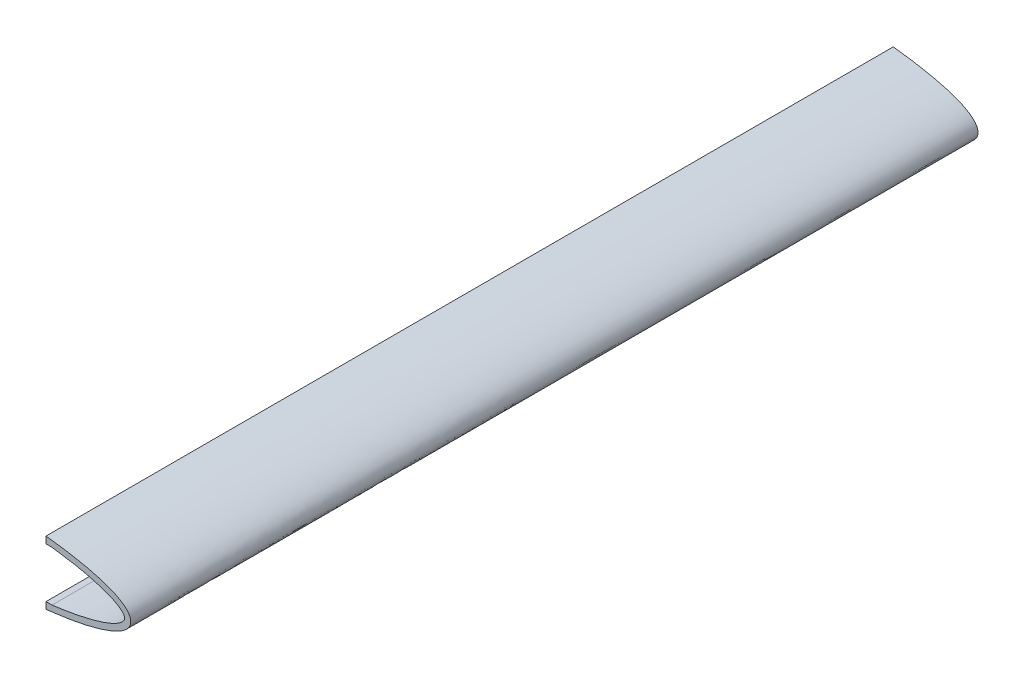
ISO-10303-21;
HEADER;
FILE_DESCRIPTION(('STEP AP214'),'2;1');
FILE_NAME('part.step','',(''),(''),'','','');
FILE_SCHEMA(('AUTOMOTIVE_DESIGN { 1 0 10303 214 1 1 1 1 }'));
ENDSEC;
DATA;
#1=APPLICATION_CONTEXT('core data for automotive mechanical design processes');
#2=APPLICATION_PROTOCOL_DEFINITION('international standard','automotive_design',2000,#1);
#3=PRODUCT_CONTEXT('',#1,'mechanical');
#4=PRODUCT('Part','Part','',(#3));
#5=PRODUCT_RELATED_PRODUCT_CATEGORY('part','',(#4));
#6=PRODUCT_DEFINITION_FORMATION('','',#4);
#7=PRODUCT_DEFINITION_CONTEXT('part definition',#1,'design');
#8=PRODUCT_DEFINITION('design','',#6,#7);
#9=PRODUCT_DEFINITION_SHAPE('','',#8);
#10=(LENGTH_UNIT() NAMED_UNIT(*) SI_UNIT(.MILLI.,.METRE.));
#11=(NAMED_UNIT(*) PLANE_ANGLE_UNIT() SI_UNIT($,.RADIAN.));
#12=(NAMED_UNIT(*) SI_UNIT($,.STERADIAN.) SOLID_ANGLE_UNIT());
#13=UNCERTAINTY_MEASURE_WITH_UNIT(LENGTH_MEASURE(1.E-05),#10,'distance_accuracy_value','');
#14=(GEOMETRIC_REPRESENTATION_CONTEXT(3) GLOBAL_UNCERTAINTY_ASSIGNED_CONTEXT((#13)) GLOBAL_UNIT_ASSIGNED_CONTEXT((#10,
#11,#12)) REPRESENTATION_CONTEXT('',''));
#15=CARTESIAN_POINT('',(0.,0.,0.));
#16=DIRECTION('',(0.,0.,1.));
#17=DIRECTION('',(1.,0.,0.));
#18=AXIS2_PLACEMENT_3D('',#15,#16,#17);
#19=CARTESIAN_POINT('',(0.,0.,444.5));
#20=CARTESIAN_POINT('',(2.09044576626194,0.236931140358332,444.5));
#21=CARTESIAN_POINT('',(6.7724621884355,0.820622556426648,444.5));
#22=CARTESIAN_POINT('',(13.771607217299,1.90452033628238,444.5));
#23=CARTESIAN_POINT('',(20.7200301298718,3.27191578656055,444.5));
#24=CARTESIAN_POINT('',(26.8369405741616,4.7927399076136,444.5));
#25=CARTESIAN_POINT('',(32.0875796112864,6.45216276775387,444.5));
#26=CARTESIAN_POINT('',(36.4452705499922,8.23472914772265,444.5));
#27=CARTESIAN_POINT('',(39.8961165926382,10.1283791479551,444.5));
#28=CARTESIAN_POINT('',(42.4348077096758,12.1368502495062,444.5));
#29=CARTESIAN_POINT('',(44.0608187154585,14.3087319322237,444.5));
#30=CARTESIAN_POINT('',(44.631372315666,16.6769815294237,444.5));
#31=CARTESIAN_POINT('',(44.0608187154579,19.0452311266237,444.5));
#32=CARTESIAN_POINT('',(42.4348077096748,21.2171128093407,444.5));
#33=CARTESIAN_POINT('',(39.8961165926364,23.2255839108912,444.5));
#34=CARTESIAN_POINT('',(36.44527054999,25.1192339111227,444.5));
#35=CARTESIAN_POINT('',(32.0875796112838,26.9018002910903,444.5));
#36=CARTESIAN_POINT('',(26.8369405741584,28.5612231512293,444.5));
#37=CARTESIAN_POINT('',(20.7200301298683,30.0820472722807,444.5));
#38=CARTESIAN_POINT('',(13.7716072172952,31.4494427225571,444.5));
#39=CARTESIAN_POINT('',(6.7724621884328,32.5333405024108,444.5));
#40=CARTESIAN_POINT('',(2.09044576626058,33.1170319184778,444.5));
#41=CARTESIAN_POINT('',(0.,33.3539630588361,444.5));
#42=B_SPLINE_CURVE_WITH_KNOTS('',3,(#19,#20,#21,#22,#23,#24,#25,#26,#27,#28,#29,#30,#31,#32,#33,
#34,#35,#36,#37,#38,#39,#40,#41),.UNSPECIFIED.,.F.,.F.,(4,1,1,1,1,1,1,1,1,1,1,1,1,1,1,1,1,1,1,1,
4),(0.424329698272851,0.434027755192763,0.446078200544609,0.456972304506157,0.466663037034508,
0.475120703886839,0.482336017878992,0.488336068220101,0.493209752146516,0.497165061608802,
0.500617191900712,0.504069322192621,0.508024631654907,0.512898315581322,0.518898365922431,
0.526113679914584,0.534571346766916,0.544262079295266,0.555156183256814,0.56720662860866,
0.576904685528565),.UNSPECIFIED.);
#43=DIRECTION('',(0.,0.,-1.));
#44=VECTOR('',#43,1.);
#45=SURFACE_OF_LINEAR_EXTRUSION('',#42,#44);
#46=CARTESIAN_POINT('',(0.,0.,0.));
#47=CARTESIAN_POINT('',(2.09044576626194,0.236931140358332,0.));
#48=CARTESIAN_POINT('',(6.7724621884355,0.820622556426648,0.));
#49=CARTESIAN_POINT('',(13.771607217299,1.90452033628238,0.));
#50=CARTESIAN_POINT('',(20.7200301298718,3.27191578656055,0.));
#51=CARTESIAN_POINT('',(26.8369405741616,4.7927399076136,0.));
#52=CARTESIAN_POINT('',(32.0875796112864,6.45216276775387,0.));
#53=CARTESIAN_POINT('',(36.4452705499922,8.23472914772265,0.));
#54=CARTESIAN_POINT('',(39.8961165926382,10.1283791479551,0.));
#55=CARTESIAN_POINT('',(42.4348077096758,12.1368502495062,0.));
#56=CARTESIAN_POINT('',(44.0608187154585,14.3087319322237,0.));
#57=CARTESIAN_POINT('',(44.631372315666,16.6769815294237,0.));
#58=CARTESIAN_POINT('',(44.0608187154579,19.0452311266237,0.));
#59=CARTESIAN_POINT('',(42.4348077096748,21.2171128093407,0.));
#60=CARTESIAN_POINT('',(39.8961165926364,23.2255839108912,0.));
#61=CARTESIAN_POINT('',(36.44527054999,25.1192339111227,0.));
#62=CARTESIAN_POINT('',(32.0875796112838,26.9018002910903,0.));
#63=CARTESIAN_POINT('',(26.8369405741584,28.5612231512293,0.));
#64=CARTESIAN_POINT('',(20.7200301298683,30.0820472722807,0.));
#65=CARTESIAN_POINT('',(13.7716072172952,31.4494427225571,0.));
#66=CARTESIAN_POINT('',(6.7724621884328,32.5333405024108,0.));
#67=CARTESIAN_POINT('',(2.09044576626058,33.1170319184778,0.));
#68=CARTESIAN_POINT('',(0.,33.3539630588361,0.));
#69=B_SPLINE_CURVE_WITH_KNOTS('',3,(#46,#47,#48,#49,#50,#51,#52,#53,#54,#55,#56,#57,#58,#59,#60,
#61,#62,#63,#64,#65,#66,#67,#68),.UNSPECIFIED.,.F.,.F.,(4,1,1,1,1,1,1,1,1,1,1,1,1,1,1,1,1,1,1,1,
4),(0.424329698272851,0.434027755192763,0.446078200544609,0.456972304506157,0.466663037034508,
0.475120703886839,0.482336017878992,0.488336068220101,0.493209752146516,0.497165061608802,
0.500617191900712,0.504069322192621,0.508024631654907,0.512898315581322,0.518898365922431,
0.526113679914584,0.534571346766916,0.544262079295266,0.555156183256814,0.56720662860866,
0.576904685528565),.UNSPECIFIED.);
#70=CARTESIAN_POINT('',(0.,0.,0.));
#71=VERTEX_POINT('',#70);
#72=CARTESIAN_POINT('',(0.,33.3539630588361,0.));
#73=VERTEX_POINT('',#72);
#74=EDGE_CURVE('E124',#71,#73,#69,.T.);
#75=ORIENTED_EDGE('',*,*,#74,.T.);
#76=DIRECTION('',(0.,0.,-1.));
#77=VECTOR('',#76,1.);
#78=CARTESIAN_POINT('',(0.,33.3539630588361,444.5));
#79=LINE('',#78,#77);
#80=CARTESIAN_POINT('',(0.,33.3539630588361,444.5));
#81=VERTEX_POINT('',#80);
#82=EDGE_CURVE('E11',#81,#73,#79,.T.);
#83=ORIENTED_EDGE('',*,*,#82,.F.);
#84=CARTESIAN_POINT('',(0.,0.,444.5));
#85=VERTEX_POINT('',#84);
#86=EDGE_CURVE('E144',#85,#81,#42,.T.);
#87=ORIENTED_EDGE('',*,*,#86,.F.);
#88=DIRECTION('',(0.,0.,-1.));
#89=VECTOR('',#88,1.);
#90=CARTESIAN_POINT('',(0.,0.,444.5));
#91=LINE('',#90,#89);
#92=EDGE_CURVE('E117',#85,#71,#91,.T.);
#93=ORIENTED_EDGE('',*,*,#92,.T.);
#94=EDGE_LOOP('',(#75,#83,#87,#93));
#95=FACE_BOUND('',#94,.T.);
#96=ADVANCED_FACE('F36',(#95),#45,.F.);
#97=CARTESIAN_POINT('',(0.,29.7751803909361,444.5));
#98=DIRECTION('',(1.,0.,0.));
#99=DIRECTION('',(0.,0.,-1.));
#100=AXIS2_PLACEMENT_3D('',#97,#98,#99);
#101=PLANE('',#100);
#102=DIRECTION('',(0.,-1.,0.));
#103=VECTOR('',#102,1.);
#104=CARTESIAN_POINT('',(0.,29.7751803909361,0.));
#105=LINE('',#104,#103);
#106=CARTESIAN_POINT('',(0.,29.7751803909361,0.));
#107=VERTEX_POINT('',#106);
#108=EDGE_CURVE('E129',#73,#107,#105,.T.);
#109=ORIENTED_EDGE('',*,*,#108,.T.);
#110=DIRECTION('',(0.,0.,-1.));
#111=VECTOR('',#110,1.);
#112=CARTESIAN_POINT('',(0.,29.7751803909361,444.5));
#113=LINE('',#112,#111);
#114=CARTESIAN_POINT('',(0.,29.7751803909361,444.5));
#115=VERTEX_POINT('',#114);
#116=EDGE_CURVE('E45',#115,#107,#113,.T.);
#117=ORIENTED_EDGE('',*,*,#116,.F.);
#118=DIRECTION('',(0.,-1.,0.));
#119=VECTOR('',#118,1.);
#120=CARTESIAN_POINT('',(0.,29.7751803909361,444.5));
#121=LINE('',#120,#119);
#122=EDGE_CURVE('E90',#81,#115,#121,.T.);
#123=ORIENTED_EDGE('',*,*,#122,.F.);
#124=ORIENTED_EDGE('',*,*,#82,.T.);
#125=EDGE_LOOP('',(#109,#117,#123,#124));
#126=FACE_BOUND('',#125,.T.);
#127=ADVANCED_FACE('F168',(#126),#101,.F.);
#128=CARTESIAN_POINT('',(3.17500000000003,29.7751803909361,444.5));
#129=DIRECTION('',(0.,1.,0.));
#130=DIRECTION('',(0.,0.,1.));
#131=AXIS2_PLACEMENT_3D('',#128,#129,#130);
#132=PLANE('',#131);
#133=DIRECTION('',(1.,0.,0.));
#134=VECTOR('',#133,1.);
#135=CARTESIAN_POINT('',(3.17500000000003,29.7751803909361,0.));
#136=LINE('',#135,#134);
#137=CARTESIAN_POINT('',(3.17500000000003,29.7751803909361,0.));
#138=VERTEX_POINT('',#137);
#139=EDGE_CURVE('E134',#107,#138,#136,.T.);
#140=ORIENTED_EDGE('',*,*,#139,.T.);
#141=DIRECTION('',(0.,0.,-1.));
#142=VECTOR('',#141,1.);
#143=CARTESIAN_POINT('',(3.17500000000003,29.7751803909361,444.5));
#144=LINE('',#143,#142);
#145=CARTESIAN_POINT('',(3.17500000000003,29.7751803909361,444.5));
#146=VERTEX_POINT('',#145);
#147=EDGE_CURVE('E112',#146,#138,#144,.T.);
#148=ORIENTED_EDGE('',*,*,#147,.F.);
#149=DIRECTION('',(1.,0.,0.));
#150=VECTOR('',#149,1.);
#151=CARTESIAN_POINT('',(3.17500000000003,29.7751803909361,444.5));
#152=LINE('',#151,#150);
#153=EDGE_CURVE('E103',#115,#146,#152,.T.);
#154=ORIENTED_EDGE('',*,*,#153,.F.);
#155=ORIENTED_EDGE('',*,*,#116,.T.);
#156=EDGE_LOOP('',(#140,#148,#154,#155));
#157=FACE_BOUND('',#156,.T.);
#158=ADVANCED_FACE('F150',(#157),#132,.F.);
#159=CARTESIAN_POINT('',(3.17500000000003,29.7751803909361,444.5));
#160=CARTESIAN_POINT('',(6.92454392199252,29.2992157633614,444.5));
#161=CARTESIAN_POINT('',(14.4226656794926,28.1776727540657,444.5));
#162=CARTESIAN_POINT('',(23.6015011416408,26.2030455470439,444.5));
#163=CARTESIAN_POINT('',(29.7887027704535,24.3165508775173,444.5));
#164=CARTESIAN_POINT('',(33.1793652538622,23.0331850936305,444.5));
#165=CARTESIAN_POINT('',(35.6148305822183,21.942108129202,444.5));
#166=CARTESIAN_POINT('',(37.8612270036908,20.7033469238479,444.5));
#167=CARTESIAN_POINT('',(39.7930158127352,19.300945318214,444.5));
#168=CARTESIAN_POINT('',(40.8822908414561,18.0224222782184,444.5));
#169=CARTESIAN_POINT('',(41.1767573914597,17.3195870140637,444.5));
#170=CARTESIAN_POINT('',(41.2632024428569,16.9234554453551,444.5));
#171=CARTESIAN_POINT('',(41.2808987785666,16.6769815294228,444.5));
#172=CARTESIAN_POINT('',(41.2632024428568,16.4305076134901,444.5));
#173=CARTESIAN_POINT('',(41.1767573914593,16.0343760447813,444.5));
#174=CARTESIAN_POINT('',(40.8822908414552,15.3315407806264,444.5));
#175=CARTESIAN_POINT('',(39.7930158127336,14.0530177406301,444.5));
#176=CARTESIAN_POINT('',(37.8612270036891,12.6506161349962,444.5));
#177=CARTESIAN_POINT('',(35.6148305822167,11.4118549296416,444.5));
#178=CARTESIAN_POINT('',(33.1793652538606,10.3207779652127,444.5));
#179=CARTESIAN_POINT('',(29.7887027704521,9.0374121813252,444.5));
#180=CARTESIAN_POINT('',(23.6015011416399,7.15091751179726,444.5));
#181=CARTESIAN_POINT('',(14.4226656794919,5.17629030477338,444.5));
#182=CARTESIAN_POINT('',(6.92454392199231,4.05474729547559,444.5));
#183=CARTESIAN_POINT('',(3.17499999999998,3.57878266790027,444.5));
#184=B_SPLINE_CURVE_WITH_KNOTS('',3,(#159,#160,#161,#162,#163,#164,#165,#166,#167,#168,#169,
#170,#171,#172,#173,#174,#175,#176,#177,#178,#179,#180,#181,#182,#183),.UNSPECIFIED.,.F.,.F.,(4,
1,1,1,1,1,1,1,1,1,1,1,1,1,1,1,1,1,1,1,1,1,4),(0.429862149969196,0.447550910452074,
0.465239670934952,0.474084051176391,0.478506241297111,0.482928431417831,0.48735062153855,
0.49177281165927,0.496195001779989,0.498406096840349,0.499511644370529,0.500617191900709,
0.501722739430889,0.502828286961069,0.505039382021428,0.509461572142148,0.513883762262867,
0.518305952383587,0.522728142504307,0.527150332625026,0.535994712866465,0.553683473349343,
0.571372233832222),.UNSPECIFIED.);
#185=DIRECTION('',(0.,0.,-1.));
#186=VECTOR('',#185,1.);
#187=SURFACE_OF_LINEAR_EXTRUSION('',#184,#186);
#188=CARTESIAN_POINT('',(3.17500000000003,29.7751803909361,0.));
#189=CARTESIAN_POINT('',(6.92454392199252,29.2992157633614,0.));
#190=CARTESIAN_POINT('',(14.4226656794926,28.1776727540657,0.));
#191=CARTESIAN_POINT('',(23.6015011416408,26.2030455470439,0.));
#192=CARTESIAN_POINT('',(29.7887027704535,24.3165508775173,0.));
#193=CARTESIAN_POINT('',(33.1793652538622,23.0331850936305,0.));
#194=CARTESIAN_POINT('',(35.6148305822183,21.942108129202,0.));
#195=CARTESIAN_POINT('',(37.8612270036908,20.7033469238479,0.));
#196=CARTESIAN_POINT('',(39.7930158127352,19.300945318214,0.));
#197=CARTESIAN_POINT('',(40.8822908414561,18.0224222782184,0.));
#198=CARTESIAN_POINT('',(41.1767573914597,17.3195870140637,0.));
#199=CARTESIAN_POINT('',(41.2632024428569,16.9234554453551,0.));
#200=CARTESIAN_POINT('',(41.2808987785666,16.6769815294228,0.));
#201=CARTESIAN_POINT('',(41.2632024428568,16.4305076134901,0.));
#202=CARTESIAN_POINT('',(41.1767573914593,16.0343760447813,0.));
#203=CARTESIAN_POINT('',(40.8822908414552,15.3315407806264,0.));
#204=CARTESIAN_POINT('',(39.7930158127336,14.0530177406301,0.));
#205=CARTESIAN_POINT('',(37.8612270036891,12.6506161349962,0.));
#206=CARTESIAN_POINT('',(35.6148305822167,11.4118549296416,0.));
#207=CARTESIAN_POINT('',(33.1793652538606,10.3207779652127,0.));
#208=CARTESIAN_POINT('',(29.7887027704521,9.0374121813252,0.));
#209=CARTESIAN_POINT('',(23.6015011416399,7.15091751179726,0.));
#210=CARTESIAN_POINT('',(14.4226656794919,5.17629030477338,0.));
#211=CARTESIAN_POINT('',(6.92454392199231,4.05474729547559,0.));
#212=CARTESIAN_POINT('',(3.17499999999998,3.57878266790027,0.));
#213=B_SPLINE_CURVE_WITH_KNOTS('',3,(#188,#189,#190,#191,#192,#193,#194,#195,#196,#197,#198,
#199,#200,#201,#202,#203,#204,#205,#206,#207,#208,#209,#210,#211,#212),.UNSPECIFIED.,.F.,.F.,(4,
1,1,1,1,1,1,1,1,1,1,1,1,1,1,1,1,1,1,1,1,1,4),(0.429862149969196,0.447550910452074,
0.465239670934952,0.474084051176391,0.478506241297111,0.482928431417831,0.48735062153855,
0.49177281165927,0.496195001779989,0.498406096840349,0.499511644370529,0.500617191900709,
0.501722739430889,0.502828286961069,0.505039382021428,0.509461572142148,0.513883762262867,
0.518305952383587,0.522728142504307,0.527150332625026,0.535994712866465,0.553683473349343,
0.571372233832222),.UNSPECIFIED.);
#214=CARTESIAN_POINT('',(3.17499999999998,3.57878266790027,0.));
#215=VERTEX_POINT('',#214);
#216=EDGE_CURVE('E111',#138,#215,#213,.T.);
#217=ORIENTED_EDGE('',*,*,#216,.T.);
#218=DIRECTION('',(0.,0.,-1.));
#219=VECTOR('',#218,1.);
#220=CARTESIAN_POINT('',(3.17499999999998,3.57878266790027,444.5));
#221=LINE('',#220,#219);
#222=CARTESIAN_POINT('',(3.17499999999998,3.57878266790027,444.5));
#223=VERTEX_POINT('',#222);
#224=EDGE_CURVE('E108',#223,#215,#221,.T.);
#225=ORIENTED_EDGE('',*,*,#224,.F.);
#226=EDGE_CURVE('E97',#146,#223,#184,.T.);
#227=ORIENTED_EDGE('',*,*,#226,.F.);
#228=ORIENTED_EDGE('',*,*,#147,.T.);
#229=EDGE_LOOP('',(#217,#225,#227,#228));
#230=FACE_BOUND('',#229,.T.);
#231=ADVANCED_FACE('F109',(#230),#187,.F.);
#232=CARTESIAN_POINT('',(3.17499999999998,3.57878266790027,444.5));
#233=DIRECTION('',(0.,-1.,0.));
#234=DIRECTION('',(1.,0.,0.));
#235=AXIS2_PLACEMENT_3D('',#232,#233,#234);
#236=PLANE('',#235);
#237=DIRECTION('',(-1.,0.,0.));
#238=VECTOR('',#237,1.);
#239=CARTESIAN_POINT('',(3.17499999999998,3.57878266790027,0.));
#240=LINE('',#239,#238);
#241=CARTESIAN_POINT('',(0.,3.57878266790028,0.));
#242=VERTEX_POINT('',#241);
#243=EDGE_CURVE('E76',#215,#242,#240,.T.);
#244=ORIENTED_EDGE('',*,*,#243,.T.);
#245=DIRECTION('',(0.,0.,-1.));
#246=VECTOR('',#245,1.);
#247=CARTESIAN_POINT('',(0.,3.57878266790028,444.5));
#248=LINE('',#247,#246);
#249=CARTESIAN_POINT('',(0.,3.57878266790028,444.5));
#250=VERTEX_POINT('',#249);
#251=EDGE_CURVE('E113',#250,#242,#248,.T.);
#252=ORIENTED_EDGE('',*,*,#251,.F.);
#253=DIRECTION('',(-1.,0.,0.));
#254=VECTOR('',#253,1.);
#255=CARTESIAN_POINT('',(3.17499999999998,3.57878266790027,444.5));
#256=LINE('',#255,#254);
#257=EDGE_CURVE('E101',#223,#250,#256,.T.);
#258=ORIENTED_EDGE('',*,*,#257,.F.);
#259=ORIENTED_EDGE('',*,*,#224,.T.);
#260=EDGE_LOOP('',(#244,#252,#258,#259));
#261=FACE_BOUND('',#260,.T.);
#262=ADVANCED_FACE('F115',(#261),#236,.F.);
#263=CARTESIAN_POINT('',(0.,3.57878266790028,444.5));
#264=DIRECTION('',(1.,0.,0.));
#265=DIRECTION('',(0.,1.,0.));
#266=AXIS2_PLACEMENT_3D('',#263,#264,#265);
#267=PLANE('',#266);
#268=DIRECTION('',(0.,-1.,0.));
#269=VECTOR('',#268,1.);
#270=CARTESIAN_POINT('',(0.,3.57878266790028,0.));
#271=LINE('',#270,#269);
#272=EDGE_CURVE('E82',#242,#71,#271,.T.);
#273=ORIENTED_EDGE('',*,*,#272,.T.);
#274=ORIENTED_EDGE('',*,*,#92,.F.);
#275=DIRECTION('',(0.,-1.,0.));
#276=VECTOR('',#275,1.);
#277=CARTESIAN_POINT('',(0.,3.57878266790028,444.5));
#278=LINE('',#277,#276);
#279=EDGE_CURVE('E53',#250,#85,#278,.T.);
#280=ORIENTED_EDGE('',*,*,#279,.F.);
#281=ORIENTED_EDGE('',*,*,#251,.T.);
#282=EDGE_LOOP('',(#273,#274,#280,#281));
#283=FACE_BOUND('',#282,.T.);
#284=ADVANCED_FACE('F157',(#283),#267,.F.);
#285=CARTESIAN_POINT('',(44.4499999999967,16.6769815294215,444.5));
#286=DIRECTION('',(0.,0.,-1.));
#287=DIRECTION('',(-1.,0.,0.));
#288=AXIS2_PLACEMENT_3D('',#285,#286,#287);
#289=PLANE('',#288);
#290=ORIENTED_EDGE('',*,*,#86,.T.);
#291=ORIENTED_EDGE('',*,*,#122,.T.);
#292=ORIENTED_EDGE('',*,*,#153,.T.);
#293=ORIENTED_EDGE('',*,*,#226,.T.);
#294=ORIENTED_EDGE('',*,*,#257,.T.);
#295=ORIENTED_EDGE('',*,*,#279,.T.);
#296=EDGE_LOOP('',(#290,#291,#292,#293,#294,#295));
#297=FACE_BOUND('',#296,.T.);
#298=ADVANCED_FACE('F99',(#297),#289,.F.);
#299=CARTESIAN_POINT('',(44.4499999999967,16.6769815294215,0.));
#300=DIRECTION('',(0.,0.,-1.));
#301=DIRECTION('',(-1.,0.,0.));
#302=AXIS2_PLACEMENT_3D('',#299,#300,#301);
#303=PLANE('',#302);
#304=ORIENTED_EDGE('',*,*,#74,.F.);
#305=ORIENTED_EDGE('',*,*,#272,.F.);
#306=ORIENTED_EDGE('',*,*,#243,.F.);
#307=ORIENTED_EDGE('',*,*,#216,.F.);
#308=ORIENTED_EDGE('',*,*,#139,.F.);
#309=ORIENTED_EDGE('',*,*,#108,.F.);
#310=EDGE_LOOP('',(#304,#305,#306,#307,#308,#309));
#311=FACE_BOUND('',#310,.T.);
#312=ADVANCED_FACE('F153',(#311),#303,.T.);
#313=CLOSED_SHELL('',(#96,#127,#158,#231,#262,#284,#298,#312));
#314=MANIFOLD_SOLID_BREP('B2',#313);
#315=ADVANCED_BREP_SHAPE_REPRESENTATION('',(#18,#314),#14);
#316=SHAPE_DEFINITION_REPRESENTATION(#9,#315);
ENDSEC;
END-ISO-10303-21;
